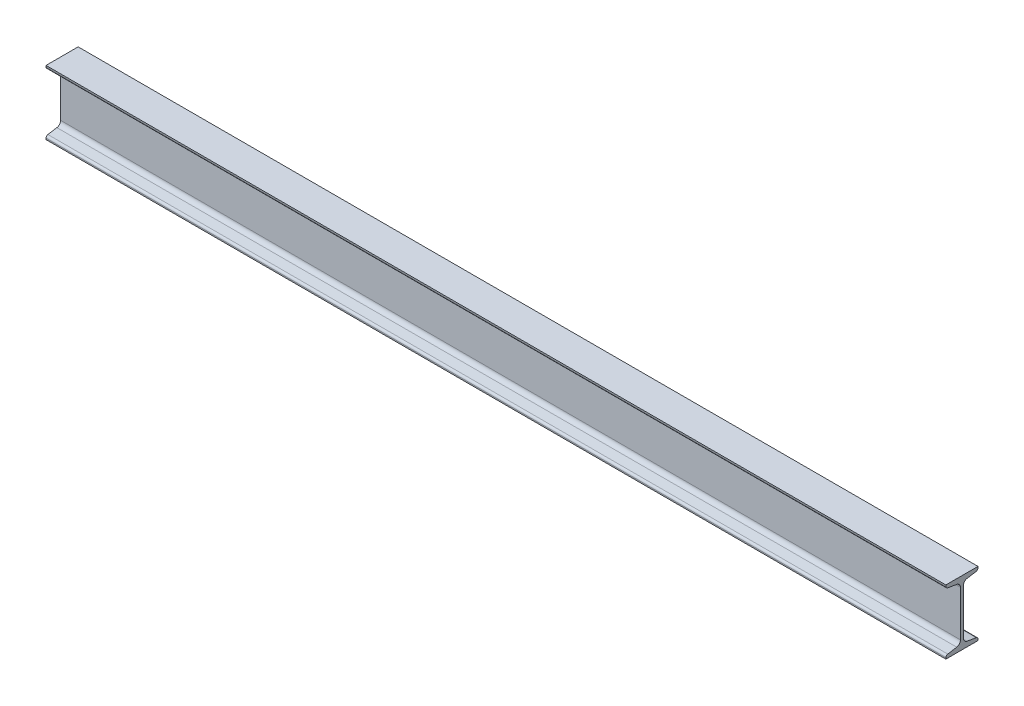
ISO-10303-21;
HEADER;
FILE_DESCRIPTION(('STEP AP214'),'2;1');
FILE_NAME('part.step','',(''),(''),'','','');
FILE_SCHEMA(('AUTOMOTIVE_DESIGN { 1 0 10303 214 1 1 1 1 }'));
ENDSEC;
DATA;
#1=APPLICATION_CONTEXT('core data for automotive mechanical design processes');
#2=APPLICATION_PROTOCOL_DEFINITION('international standard','automotive_design',2000,#1);
#3=PRODUCT_CONTEXT('',#1,'mechanical');
#4=PRODUCT('Part','Part','',(#3));
#5=PRODUCT_RELATED_PRODUCT_CATEGORY('part','',(#4));
#6=PRODUCT_DEFINITION_FORMATION('','',#4);
#7=PRODUCT_DEFINITION_CONTEXT('part definition',#1,'design');
#8=PRODUCT_DEFINITION('design','',#6,#7);
#9=PRODUCT_DEFINITION_SHAPE('','',#8);
#10=(LENGTH_UNIT() NAMED_UNIT(*) SI_UNIT(.MILLI.,.METRE.));
#11=(NAMED_UNIT(*) PLANE_ANGLE_UNIT() SI_UNIT($,.RADIAN.));
#12=(NAMED_UNIT(*) SI_UNIT($,.STERADIAN.) SOLID_ANGLE_UNIT());
#13=UNCERTAINTY_MEASURE_WITH_UNIT(LENGTH_MEASURE(1.E-05),#10,'distance_accuracy_value','');
#14=(GEOMETRIC_REPRESENTATION_CONTEXT(3) GLOBAL_UNCERTAINTY_ASSIGNED_CONTEXT((#13)) GLOBAL_UNIT_ASSIGNED_CONTEXT((#10,
#11,#12)) REPRESENTATION_CONTEXT('',''));
#15=CARTESIAN_POINT('',(0.,0.,0.));
#16=DIRECTION('',(0.,0.,1.));
#17=DIRECTION('',(1.,0.,0.));
#18=AXIS2_PLACEMENT_3D('',#15,#16,#17);
#19=CARTESIAN_POINT('',(1400.,50.,25.));
#20=DIRECTION('',(0.,-1.,0.));
#21=DIRECTION('',(0.,0.,-1.));
#22=AXIS2_PLACEMENT_3D('',#19,#20,#21);
#23=PLANE('',#22);
#24=DIRECTION('',(0.,0.,1.));
#25=VECTOR('',#24,1.);
#26=CARTESIAN_POINT('',(0.,50.,25.));
#27=LINE('',#26,#25);
#28=CARTESIAN_POINT('',(0.,50.0000000000001,-24.9999999999999));
#29=VERTEX_POINT('',#28);
#30=CARTESIAN_POINT('',(0.,50.,25.));
#31=VERTEX_POINT('',#30);
#32=EDGE_CURVE('E281',#29,#31,#27,.T.);
#33=ORIENTED_EDGE('',*,*,#32,.T.);
#34=DIRECTION('',(-1.,0.,0.));
#35=VECTOR('',#34,1.);
#36=CARTESIAN_POINT('',(1400.,50.,25.));
#37=LINE('',#36,#35);
#38=CARTESIAN_POINT('',(1400.,50.,25.));
#39=VERTEX_POINT('',#38);
#40=EDGE_CURVE('E13',#39,#31,#37,.T.);
#41=ORIENTED_EDGE('',*,*,#40,.F.);
#42=DIRECTION('',(0.,0.,1.));
#43=VECTOR('',#42,1.);
#44=CARTESIAN_POINT('',(1400.,50.,25.));
#45=LINE('',#44,#43);
#46=CARTESIAN_POINT('',(1400.,50.0000000000001,-24.9999999999999));
#47=VERTEX_POINT('',#46);
#48=EDGE_CURVE('E339',#47,#39,#45,.T.);
#49=ORIENTED_EDGE('',*,*,#48,.F.);
#50=DIRECTION('',(-1.,0.,0.));
#51=VECTOR('',#50,1.);
#52=CARTESIAN_POINT('',(1400.,50.0000000000001,-24.9999999999999));
#53=LINE('',#52,#51);
#54=EDGE_CURVE('E277',#47,#29,#53,.T.);
#55=ORIENTED_EDGE('',*,*,#54,.T.);
#56=EDGE_LOOP('',(#33,#41,#49,#55));
#57=FACE_BOUND('',#56,.T.);
#58=ADVANCED_FACE('F108',(#57),#23,.F.);
#59=CARTESIAN_POINT('',(1400.,48.0606710225334,25.0000000000002));
#60=DIRECTION('',(0.,0.,-1.));
#61=DIRECTION('',(0.,1.,0.));
#62=AXIS2_PLACEMENT_3D('',#59,#60,#61);
#63=PLANE('',#62);
#64=DIRECTION('',(0.,-1.,0.));
#65=VECTOR('',#64,1.);
#66=CARTESIAN_POINT('',(0.,48.0606710225334,25.0000000000002));
#67=LINE('',#66,#65);
#68=CARTESIAN_POINT('',(0.,48.0606710225334,25.0000000000002));
#69=VERTEX_POINT('',#68);
#70=EDGE_CURVE('E285',#31,#69,#67,.T.);
#71=ORIENTED_EDGE('',*,*,#70,.T.);
#72=DIRECTION('',(-1.,0.,0.));
#73=VECTOR('',#72,1.);
#74=CARTESIAN_POINT('',(1400.,48.0606710225334,25.0000000000002));
#75=LINE('',#74,#73);
#76=CARTESIAN_POINT('',(1400.,48.0606710225334,25.0000000000002));
#77=VERTEX_POINT('',#76);
#78=EDGE_CURVE('E117',#77,#69,#75,.T.);
#79=ORIENTED_EDGE('',*,*,#78,.F.);
#80=DIRECTION('',(0.,-1.,0.));
#81=VECTOR('',#80,1.);
#82=CARTESIAN_POINT('',(1400.,48.0606710225334,25.0000000000002));
#83=LINE('',#82,#81);
#84=EDGE_CURVE('E204',#39,#77,#83,.T.);
#85=ORIENTED_EDGE('',*,*,#84,.F.);
#86=ORIENTED_EDGE('',*,*,#40,.T.);
#87=EDGE_LOOP('',(#71,#79,#85,#86));
#88=FACE_BOUND('',#87,.T.);
#89=ADVANCED_FACE('F489',(#88),#63,.F.);
#90=CARTESIAN_POINT('',(1400.,48.0606710225334,21.5000000000002));
#91=DIRECTION('',(-1.,0.,0.));
#92=DIRECTION('',(0.,0.,1.));
#93=AXIS2_PLACEMENT_3D('',#90,#91,#92);
#94=CYLINDRICAL_SURFACE('',#93,3.5);
#95=CARTESIAN_POINT('',(0.,48.0606710225334,21.5000000000002));
#96=DIRECTION('',(1.,0.,0.));
#97=DIRECTION('',(0.,0.,-1.));
#98=AXIS2_PLACEMENT_3D('',#95,#96,#97);
#99=CIRCLE('',#98,3.5);
#100=CARTESIAN_POINT('',(0.,44.6082990961308,22.0754372961389));
#101=VERTEX_POINT('',#100);
#102=EDGE_CURVE('E288',#69,#101,#99,.T.);
#103=ORIENTED_EDGE('',*,*,#102,.T.);
#104=DIRECTION('',(-1.,0.,0.));
#105=VECTOR('',#104,1.);
#106=CARTESIAN_POINT('',(1400.,44.6082990961308,22.0754372961389));
#107=LINE('',#106,#105);
#108=CARTESIAN_POINT('',(1400.,44.6082990961308,22.0754372961389));
#109=VERTEX_POINT('',#108);
#110=EDGE_CURVE('E398',#109,#101,#107,.T.);
#111=ORIENTED_EDGE('',*,*,#110,.F.);
#112=CARTESIAN_POINT('',(1400.,48.0606710225334,21.5000000000002));
#113=DIRECTION('',(1.,0.,0.));
#114=DIRECTION('',(0.,0.,-1.));
#115=AXIS2_PLACEMENT_3D('',#112,#113,#114);
#116=CIRCLE('',#115,3.5);
#117=EDGE_CURVE('E408',#77,#109,#116,.T.);
#118=ORIENTED_EDGE('',*,*,#117,.F.);
#119=ORIENTED_EDGE('',*,*,#78,.T.);
#120=EDGE_LOOP('',(#103,#111,#118,#119));
#121=FACE_BOUND('',#120,.T.);
#122=ADVANCED_FACE('F406',(#121),#94,.T.);
#123=CARTESIAN_POINT('',(1400.,42.2787438528051,8.0991254077226));
#124=DIRECTION('',(0.,0.986391978972161,-0.164410656039636));
#125=DIRECTION('',(0.,0.164410656039636,0.986391978972161));
#126=AXIS2_PLACEMENT_3D('',#123,#124,#125);
#127=PLANE('',#126);
#128=DIRECTION('',(0.,-0.164410656039636,-0.986391978972161));
#129=VECTOR('',#128,1.);
#130=CARTESIAN_POINT('',(0.,42.2787438528051,8.0991254077226));
#131=LINE('',#130,#129);
#132=CARTESIAN_POINT('',(0.,42.278743852805,8.09912540772262));
#133=VERTEX_POINT('',#132);
#134=EDGE_CURVE('E291',#101,#133,#131,.T.);
#135=ORIENTED_EDGE('',*,*,#134,.T.);
#136=DIRECTION('',(-1.,0.,0.));
#137=VECTOR('',#136,1.);
#138=CARTESIAN_POINT('',(1400.,42.278743852805,8.09912540772262));
#139=LINE('',#138,#137);
#140=CARTESIAN_POINT('',(1400.,42.278743852805,8.09912540772262));
#141=VERTEX_POINT('',#140);
#142=EDGE_CURVE('E394',#141,#133,#139,.T.);
#143=ORIENTED_EDGE('',*,*,#142,.F.);
#144=DIRECTION('',(0.,-0.164410656039636,-0.986391978972161));
#145=VECTOR('',#144,1.);
#146=CARTESIAN_POINT('',(1400.,42.2787438528051,8.0991254077226));
#147=LINE('',#146,#145);
#148=EDGE_CURVE('E427',#109,#141,#147,.T.);
#149=ORIENTED_EDGE('',*,*,#148,.F.);
#150=ORIENTED_EDGE('',*,*,#110,.T.);
#151=EDGE_LOOP('',(#135,#143,#149,#150));
#152=FACE_BOUND('',#151,.T.);
#153=ADVANCED_FACE('F417',(#152),#127,.F.);
#154=CARTESIAN_POINT('',(1400.,35.374,9.25000000000002));
#155=DIRECTION('',(-1.,0.,0.));
#156=DIRECTION('',(0.,0.,1.));
#157=AXIS2_PLACEMENT_3D('',#154,#155,#156);
#158=CYLINDRICAL_SURFACE('',#157,6.99999999999985);
#159=CARTESIAN_POINT('',(0.,35.374,9.25000000000002));
#160=DIRECTION('',(-1.,0.,0.));
#161=DIRECTION('',(0.,0.,-1.));
#162=AXIS2_PLACEMENT_3D('',#159,#160,#161);
#163=CIRCLE('',#162,6.99999999999985);
#164=CARTESIAN_POINT('',(0.,35.374,2.25000000000028));
#165=VERTEX_POINT('',#164);
#166=EDGE_CURVE('E294',#133,#165,#163,.T.);
#167=ORIENTED_EDGE('',*,*,#166,.T.);
#168=DIRECTION('',(-1.,0.,0.));
#169=VECTOR('',#168,1.);
#170=CARTESIAN_POINT('',(1400.,35.374,2.25000000000028));
#171=LINE('',#170,#169);
#172=CARTESIAN_POINT('',(1400.,35.374,2.25000000000028));
#173=VERTEX_POINT('',#172);
#174=EDGE_CURVE('E390',#173,#165,#171,.T.);
#175=ORIENTED_EDGE('',*,*,#174,.F.);
#176=CARTESIAN_POINT('',(1400.,35.374,9.25000000000002));
#177=DIRECTION('',(-1.,0.,0.));
#178=DIRECTION('',(0.,0.,-1.));
#179=AXIS2_PLACEMENT_3D('',#176,#177,#178);
#180=CIRCLE('',#179,6.99999999999985);
#181=EDGE_CURVE('E423',#141,#173,#180,.T.);
#182=ORIENTED_EDGE('',*,*,#181,.F.);
#183=ORIENTED_EDGE('',*,*,#142,.T.);
#184=EDGE_LOOP('',(#167,#175,#182,#183));
#185=FACE_BOUND('',#184,.T.);
#186=ADVANCED_FACE('F421',(#185),#158,.F.);
#187=CARTESIAN_POINT('',(1400.,-35.374,2.24999999999999));
#188=DIRECTION('',(0.,0.,-1.));
#189=DIRECTION('',(0.,1.,0.));
#190=AXIS2_PLACEMENT_3D('',#187,#188,#189);
#191=PLANE('',#190);
#192=DIRECTION('',(0.,-1.,0.));
#193=VECTOR('',#192,1.);
#194=CARTESIAN_POINT('',(0.,-35.374,2.24999999999999));
#195=LINE('',#194,#193);
#196=CARTESIAN_POINT('',(0.,-35.374,2.24999999999999));
#197=VERTEX_POINT('',#196);
#198=EDGE_CURVE('E297',#165,#197,#195,.T.);
#199=ORIENTED_EDGE('',*,*,#198,.T.);
#200=DIRECTION('',(-1.,0.,0.));
#201=VECTOR('',#200,1.);
#202=CARTESIAN_POINT('',(1400.,-35.374,2.24999999999999));
#203=LINE('',#202,#201);
#204=CARTESIAN_POINT('',(1400.,-35.374,2.24999999999999));
#205=VERTEX_POINT('',#204);
#206=EDGE_CURVE('E386',#205,#197,#203,.T.);
#207=ORIENTED_EDGE('',*,*,#206,.F.);
#208=DIRECTION('',(0.,-1.,0.));
#209=VECTOR('',#208,1.);
#210=CARTESIAN_POINT('',(1400.,-35.374,2.24999999999999));
#211=LINE('',#210,#209);
#212=EDGE_CURVE('E426',#173,#205,#211,.T.);
#213=ORIENTED_EDGE('',*,*,#212,.F.);
#214=ORIENTED_EDGE('',*,*,#174,.T.);
#215=EDGE_LOOP('',(#199,#207,#213,#214));
#216=FACE_BOUND('',#215,.T.);
#217=ADVANCED_FACE('F502',(#216),#191,.F.);
#218=CARTESIAN_POINT('',(1400.,-35.374,9.24999999999996));
#219=DIRECTION('',(-1.,0.,0.));
#220=DIRECTION('',(0.,0.,1.));
#221=AXIS2_PLACEMENT_3D('',#218,#219,#220);
#222=CYLINDRICAL_SURFACE('',#221,6.99999999999997);
#223=CARTESIAN_POINT('',(0.,-35.374,9.24999999999996));
#224=DIRECTION('',(-1.,0.,0.));
#225=DIRECTION('',(0.,0.,-1.));
#226=AXIS2_PLACEMENT_3D('',#223,#224,#225);
#227=CIRCLE('',#226,6.99999999999997);
#228=CARTESIAN_POINT('',(0.,-42.2787438528051,8.09912540772244));
#229=VERTEX_POINT('',#228);
#230=EDGE_CURVE('E300',#197,#229,#227,.T.);
#231=ORIENTED_EDGE('',*,*,#230,.T.);
#232=DIRECTION('',(-1.,0.,0.));
#233=VECTOR('',#232,1.);
#234=CARTESIAN_POINT('',(1400.,-42.2787438528051,8.09912540772244));
#235=LINE('',#234,#233);
#236=CARTESIAN_POINT('',(1400.,-42.2787438528051,8.09912540772244));
#237=VERTEX_POINT('',#236);
#238=EDGE_CURVE('E382',#237,#229,#235,.T.);
#239=ORIENTED_EDGE('',*,*,#238,.F.);
#240=CARTESIAN_POINT('',(1400.,-35.374,9.24999999999996));
#241=DIRECTION('',(-1.,0.,0.));
#242=DIRECTION('',(0.,0.,-1.));
#243=AXIS2_PLACEMENT_3D('',#240,#241,#242);
#244=CIRCLE('',#243,6.99999999999997);
#245=EDGE_CURVE('E431',#205,#237,#244,.T.);
#246=ORIENTED_EDGE('',*,*,#245,.F.);
#247=ORIENTED_EDGE('',*,*,#206,.T.);
#248=EDGE_LOOP('',(#231,#239,#246,#247));
#249=FACE_BOUND('',#248,.T.);
#250=ADVANCED_FACE('F505',(#249),#222,.F.);
#251=CARTESIAN_POINT('',(1400.,-44.608299096131,22.0754372961385));
#252=DIRECTION('',(0.,-0.98639197897216,-0.164410656039645));
#253=DIRECTION('',(0.,0.164410656039645,-0.98639197897216));
#254=AXIS2_PLACEMENT_3D('',#251,#252,#253);
#255=PLANE('',#254);
#256=DIRECTION('',(0.,-0.164410656039645,0.98639197897216));
#257=VECTOR('',#256,1.);
#258=CARTESIAN_POINT('',(0.,-44.608299096131,22.0754372961385));
#259=LINE('',#258,#257);
#260=CARTESIAN_POINT('',(0.,-44.608299096131,22.0754372961385));
#261=VERTEX_POINT('',#260);
#262=EDGE_CURVE('E303',#229,#261,#259,.T.);
#263=ORIENTED_EDGE('',*,*,#262,.T.);
#264=DIRECTION('',(-1.,0.,0.));
#265=VECTOR('',#264,1.);
#266=CARTESIAN_POINT('',(1400.,-44.608299096131,22.0754372961385));
#267=LINE('',#266,#265);
#268=CARTESIAN_POINT('',(1400.,-44.608299096131,22.0754372961385));
#269=VERTEX_POINT('',#268);
#270=EDGE_CURVE('E378',#269,#261,#267,.T.);
#271=ORIENTED_EDGE('',*,*,#270,.F.);
#272=DIRECTION('',(0.,-0.164410656039645,0.98639197897216));
#273=VECTOR('',#272,1.);
#274=CARTESIAN_POINT('',(1400.,-44.608299096131,22.0754372961385));
#275=LINE('',#274,#273);
#276=EDGE_CURVE('E438',#237,#269,#275,.T.);
#277=ORIENTED_EDGE('',*,*,#276,.F.);
#278=ORIENTED_EDGE('',*,*,#238,.T.);
#279=EDGE_LOOP('',(#263,#271,#277,#278));
#280=FACE_BOUND('',#279,.T.);
#281=ADVANCED_FACE('F509',(#280),#255,.F.);
#282=CARTESIAN_POINT('',(1400.,-48.0606710225336,21.4999999999997));
#283=DIRECTION('',(-1.,0.,0.));
#284=DIRECTION('',(0.,0.,1.));
#285=AXIS2_PLACEMENT_3D('',#282,#283,#284);
#286=CYLINDRICAL_SURFACE('',#285,3.50000000000003);
#287=CARTESIAN_POINT('',(0.,-48.0606710225336,21.4999999999997));
#288=DIRECTION('',(1.,0.,0.));
#289=DIRECTION('',(0.,0.,-1.));
#290=AXIS2_PLACEMENT_3D('',#287,#288,#289);
#291=CIRCLE('',#290,3.50000000000003);
#292=CARTESIAN_POINT('',(0.,-48.0606710225335,24.9999999999998));
#293=VERTEX_POINT('',#292);
#294=EDGE_CURVE('E306',#261,#293,#291,.T.);
#295=ORIENTED_EDGE('',*,*,#294,.T.);
#296=DIRECTION('',(-1.,0.,0.));
#297=VECTOR('',#296,1.);
#298=CARTESIAN_POINT('',(1400.,-48.0606710225335,24.9999999999998));
#299=LINE('',#298,#297);
#300=CARTESIAN_POINT('',(1400.,-48.0606710225335,24.9999999999998));
#301=VERTEX_POINT('',#300);
#302=EDGE_CURVE('E374',#301,#293,#299,.T.);
#303=ORIENTED_EDGE('',*,*,#302,.F.);
#304=CARTESIAN_POINT('',(1400.,-48.0606710225336,21.4999999999997));
#305=DIRECTION('',(1.,0.,0.));
#306=DIRECTION('',(0.,0.,-1.));
#307=AXIS2_PLACEMENT_3D('',#304,#305,#306);
#308=CIRCLE('',#307,3.50000000000003);
#309=EDGE_CURVE('E441',#269,#301,#308,.T.);
#310=ORIENTED_EDGE('',*,*,#309,.F.);
#311=ORIENTED_EDGE('',*,*,#270,.T.);
#312=EDGE_LOOP('',(#295,#303,#310,#311));
#313=FACE_BOUND('',#312,.T.);
#314=ADVANCED_FACE('F513',(#313),#286,.T.);
#315=CARTESIAN_POINT('',(1400.,-50.0000000000001,24.9999999999998));
#316=DIRECTION('',(0.,0.,-1.));
#317=DIRECTION('',(0.,1.,0.));
#318=AXIS2_PLACEMENT_3D('',#315,#316,#317);
#319=PLANE('',#318);
#320=DIRECTION('',(0.,-1.,0.));
#321=VECTOR('',#320,1.);
#322=CARTESIAN_POINT('',(0.,-50.0000000000001,24.9999999999998));
#323=LINE('',#322,#321);
#324=CARTESIAN_POINT('',(0.,-50.0000000000001,24.9999999999998));
#325=VERTEX_POINT('',#324);
#326=EDGE_CURVE('E309',#293,#325,#323,.T.);
#327=ORIENTED_EDGE('',*,*,#326,.T.);
#328=DIRECTION('',(-1.,0.,0.));
#329=VECTOR('',#328,1.);
#330=CARTESIAN_POINT('',(1400.,-50.0000000000001,24.9999999999998));
#331=LINE('',#330,#329);
#332=CARTESIAN_POINT('',(1400.,-50.0000000000001,24.9999999999998));
#333=VERTEX_POINT('',#332);
#334=EDGE_CURVE('E370',#333,#325,#331,.T.);
#335=ORIENTED_EDGE('',*,*,#334,.F.);
#336=DIRECTION('',(0.,-1.,0.));
#337=VECTOR('',#336,1.);
#338=CARTESIAN_POINT('',(1400.,-50.0000000000001,24.9999999999998));
#339=LINE('',#338,#337);
#340=EDGE_CURVE('E444',#301,#333,#339,.T.);
#341=ORIENTED_EDGE('',*,*,#340,.F.);
#342=ORIENTED_EDGE('',*,*,#302,.T.);
#343=EDGE_LOOP('',(#327,#335,#341,#342));
#344=FACE_BOUND('',#343,.T.);
#345=ADVANCED_FACE('F517',(#344),#319,.F.);
#346=CARTESIAN_POINT('',(1400.,-49.9999999999999,-25.0000000000002));
#347=DIRECTION('',(0.,1.,0.));
#348=DIRECTION('',(0.,0.,1.));
#349=AXIS2_PLACEMENT_3D('',#346,#347,#348);
#350=PLANE('',#349);
#351=DIRECTION('',(0.,0.,-1.));
#352=VECTOR('',#351,1.);
#353=CARTESIAN_POINT('',(0.,-49.9999999999999,-25.0000000000002));
#354=LINE('',#353,#352);
#355=CARTESIAN_POINT('',(0.,-49.9999999999999,-25.0000000000002));
#356=VERTEX_POINT('',#355);
#357=EDGE_CURVE('E312',#325,#356,#354,.T.);
#358=ORIENTED_EDGE('',*,*,#357,.T.);
#359=DIRECTION('',(-1.,0.,0.));
#360=VECTOR('',#359,1.);
#361=CARTESIAN_POINT('',(1400.,-49.9999999999999,-25.0000000000002));
#362=LINE('',#361,#360);
#363=CARTESIAN_POINT('',(1400.,-49.9999999999999,-25.0000000000002));
#364=VERTEX_POINT('',#363);
#365=EDGE_CURVE('E366',#364,#356,#362,.T.);
#366=ORIENTED_EDGE('',*,*,#365,.F.);
#367=DIRECTION('',(0.,0.,-1.));
#368=VECTOR('',#367,1.);
#369=CARTESIAN_POINT('',(1400.,-49.9999999999999,-25.0000000000002));
#370=LINE('',#369,#368);
#371=EDGE_CURVE('E447',#333,#364,#370,.T.);
#372=ORIENTED_EDGE('',*,*,#371,.F.);
#373=ORIENTED_EDGE('',*,*,#334,.T.);
#374=EDGE_LOOP('',(#358,#366,#372,#373));
#375=FACE_BOUND('',#374,.T.);
#376=ADVANCED_FACE('F521',(#375),#350,.F.);
#377=CARTESIAN_POINT('',(1400.,-48.0606710225333,-25.0000000000002));
#378=DIRECTION('',(0.,0.,1.));
#379=DIRECTION('',(0.,-1.,0.));
#380=AXIS2_PLACEMENT_3D('',#377,#378,#379);
#381=PLANE('',#380);
#382=DIRECTION('',(0.,1.,0.));
#383=VECTOR('',#382,1.);
#384=CARTESIAN_POINT('',(0.,-48.0606710225333,-25.0000000000002));
#385=LINE('',#384,#383);
#386=CARTESIAN_POINT('',(0.,-48.0606710225333,-25.0000000000002));
#387=VERTEX_POINT('',#386);
#388=EDGE_CURVE('E315',#356,#387,#385,.T.);
#389=ORIENTED_EDGE('',*,*,#388,.T.);
#390=DIRECTION('',(-1.,0.,0.));
#391=VECTOR('',#390,1.);
#392=CARTESIAN_POINT('',(1400.,-48.0606710225333,-25.0000000000002));
#393=LINE('',#392,#391);
#394=CARTESIAN_POINT('',(1400.,-48.0606710225333,-25.0000000000002));
#395=VERTEX_POINT('',#394);
#396=EDGE_CURVE('E362',#395,#387,#393,.T.);
#397=ORIENTED_EDGE('',*,*,#396,.F.);
#398=DIRECTION('',(0.,1.,0.));
#399=VECTOR('',#398,1.);
#400=CARTESIAN_POINT('',(1400.,-48.0606710225333,-25.0000000000002));
#401=LINE('',#400,#399);
#402=EDGE_CURVE('E450',#364,#395,#401,.T.);
#403=ORIENTED_EDGE('',*,*,#402,.F.);
#404=ORIENTED_EDGE('',*,*,#365,.T.);
#405=EDGE_LOOP('',(#389,#397,#403,#404));
#406=FACE_BOUND('',#405,.T.);
#407=ADVANCED_FACE('F525',(#406),#381,.F.);
#408=CARTESIAN_POINT('',(1400.,-48.0606710225333,-21.5000000000003));
#409=DIRECTION('',(-1.,0.,0.));
#410=DIRECTION('',(0.,0.,1.));
#411=AXIS2_PLACEMENT_3D('',#408,#409,#410);
#412=CYLINDRICAL_SURFACE('',#411,3.49999999999993);
#413=CARTESIAN_POINT('',(0.,-48.0606710225333,-21.5000000000003));
#414=DIRECTION('',(1.,0.,0.));
#415=DIRECTION('',(0.,0.,1.));
#416=AXIS2_PLACEMENT_3D('',#413,#414,#415);
#417=CIRCLE('',#416,3.49999999999993);
#418=CARTESIAN_POINT('',(0.,-44.6082990961308,-22.075437296139));
#419=VERTEX_POINT('',#418);
#420=EDGE_CURVE('E318',#387,#419,#417,.T.);
#421=ORIENTED_EDGE('',*,*,#420,.T.);
#422=DIRECTION('',(-1.,0.,0.));
#423=VECTOR('',#422,1.);
#424=CARTESIAN_POINT('',(1400.,-44.6082990961308,-22.075437296139));
#425=LINE('',#424,#423);
#426=CARTESIAN_POINT('',(1400.,-44.6082990961308,-22.075437296139));
#427=VERTEX_POINT('',#426);
#428=EDGE_CURVE('E358',#427,#419,#425,.T.);
#429=ORIENTED_EDGE('',*,*,#428,.F.);
#430=CARTESIAN_POINT('',(1400.,-48.0606710225333,-21.5000000000003));
#431=DIRECTION('',(1.,0.,0.));
#432=DIRECTION('',(0.,0.,1.));
#433=AXIS2_PLACEMENT_3D('',#430,#431,#432);
#434=CIRCLE('',#433,3.49999999999993);
#435=EDGE_CURVE('E453',#395,#427,#434,.T.);
#436=ORIENTED_EDGE('',*,*,#435,.F.);
#437=ORIENTED_EDGE('',*,*,#396,.T.);
#438=EDGE_LOOP('',(#421,#429,#436,#437));
#439=FACE_BOUND('',#438,.T.);
#440=ADVANCED_FACE('F529',(#439),#412,.T.);
#441=CARTESIAN_POINT('',(1400.,-42.2787438528052,-8.09912540772258));
#442=DIRECTION('',(0.,-0.986391978972163,0.164410656039625));
#443=DIRECTION('',(0.,-0.164410656039625,-0.986391978972163));
#444=AXIS2_PLACEMENT_3D('',#441,#442,#443);
#445=PLANE('',#444);
#446=DIRECTION('',(0.,0.164410656039625,0.986391978972163));
#447=VECTOR('',#446,1.);
#448=CARTESIAN_POINT('',(0.,-42.2787438528052,-8.09912540772258));
#449=LINE('',#448,#447);
#450=CARTESIAN_POINT('',(0.,-42.2787438528051,-8.09912540772259));
#451=VERTEX_POINT('',#450);
#452=EDGE_CURVE('E321',#419,#451,#449,.T.);
#453=ORIENTED_EDGE('',*,*,#452,.T.);
#454=DIRECTION('',(-1.,0.,0.));
#455=VECTOR('',#454,1.);
#456=CARTESIAN_POINT('',(1400.,-42.2787438528051,-8.09912540772259));
#457=LINE('',#456,#455);
#458=CARTESIAN_POINT('',(1400.,-42.2787438528051,-8.09912540772259));
#459=VERTEX_POINT('',#458);
#460=EDGE_CURVE('E354',#459,#451,#457,.T.);
#461=ORIENTED_EDGE('',*,*,#460,.F.);
#462=DIRECTION('',(0.,0.164410656039625,0.986391978972163));
#463=VECTOR('',#462,1.);
#464=CARTESIAN_POINT('',(1400.,-42.2787438528052,-8.09912540772258));
#465=LINE('',#464,#463);
#466=EDGE_CURVE('E456',#427,#459,#465,.T.);
#467=ORIENTED_EDGE('',*,*,#466,.F.);
#468=ORIENTED_EDGE('',*,*,#428,.T.);
#469=EDGE_LOOP('',(#453,#461,#467,#468));
#470=FACE_BOUND('',#469,.T.);
#471=ADVANCED_FACE('F533',(#470),#445,.F.);
#472=CARTESIAN_POINT('',(1400.,-35.374,-9.24999999999992));
#473=DIRECTION('',(-1.,0.,0.));
#474=DIRECTION('',(0.,0.,1.));
#475=AXIS2_PLACEMENT_3D('',#472,#473,#474);
#476=CYLINDRICAL_SURFACE('',#475,6.99999999999999);
#477=CARTESIAN_POINT('',(0.,-35.374,-9.24999999999992));
#478=DIRECTION('',(-1.,0.,0.));
#479=DIRECTION('',(0.,0.,-1.));
#480=AXIS2_PLACEMENT_3D('',#477,#478,#479);
#481=CIRCLE('',#480,6.99999999999999);
#482=CARTESIAN_POINT('',(0.,-35.374,-2.24999999999999));
#483=VERTEX_POINT('',#482);
#484=EDGE_CURVE('E324',#451,#483,#481,.T.);
#485=ORIENTED_EDGE('',*,*,#484,.T.);
#486=DIRECTION('',(-1.,0.,0.));
#487=VECTOR('',#486,1.);
#488=CARTESIAN_POINT('',(1400.,-35.374,-2.24999999999999));
#489=LINE('',#488,#487);
#490=CARTESIAN_POINT('',(1400.,-35.374,-2.24999999999999));
#491=VERTEX_POINT('',#490);
#492=EDGE_CURVE('E350',#491,#483,#489,.T.);
#493=ORIENTED_EDGE('',*,*,#492,.F.);
#494=CARTESIAN_POINT('',(1400.,-35.374,-9.24999999999992));
#495=DIRECTION('',(-1.,0.,0.));
#496=DIRECTION('',(0.,0.,-1.));
#497=AXIS2_PLACEMENT_3D('',#494,#495,#496);
#498=CIRCLE('',#497,6.99999999999999);
#499=EDGE_CURVE('E459',#459,#491,#498,.T.);
#500=ORIENTED_EDGE('',*,*,#499,.F.);
#501=ORIENTED_EDGE('',*,*,#460,.T.);
#502=EDGE_LOOP('',(#485,#493,#500,#501));
#503=FACE_BOUND('',#502,.T.);
#504=ADVANCED_FACE('F537',(#503),#476,.F.);
#505=CARTESIAN_POINT('',(1400.,35.374,-2.24999999999971));
#506=DIRECTION('',(0.,0.,1.));
#507=DIRECTION('',(0.,-1.,0.));
#508=AXIS2_PLACEMENT_3D('',#505,#506,#507);
#509=PLANE('',#508);
#510=DIRECTION('',(0.,1.,0.));
#511=VECTOR('',#510,1.);
#512=CARTESIAN_POINT('',(0.,35.374,-2.24999999999971));
#513=LINE('',#512,#511);
#514=CARTESIAN_POINT('',(0.,35.374,-2.24999999999967));
#515=VERTEX_POINT('',#514);
#516=EDGE_CURVE('E327',#483,#515,#513,.T.);
#517=ORIENTED_EDGE('',*,*,#516,.T.);
#518=DIRECTION('',(-1.,0.,0.));
#519=VECTOR('',#518,1.);
#520=CARTESIAN_POINT('',(1400.,35.374,-2.24999999999967));
#521=LINE('',#520,#519);
#522=CARTESIAN_POINT('',(1400.,35.374,-2.24999999999967));
#523=VERTEX_POINT('',#522);
#524=EDGE_CURVE('E346',#523,#515,#521,.T.);
#525=ORIENTED_EDGE('',*,*,#524,.F.);
#526=DIRECTION('',(0.,1.,0.));
#527=VECTOR('',#526,1.);
#528=CARTESIAN_POINT('',(1400.,35.374,-2.24999999999971));
#529=LINE('',#528,#527);
#530=EDGE_CURVE('E462',#491,#523,#529,.T.);
#531=ORIENTED_EDGE('',*,*,#530,.F.);
#532=ORIENTED_EDGE('',*,*,#492,.T.);
#533=EDGE_LOOP('',(#517,#525,#531,#532));
#534=FACE_BOUND('',#533,.T.);
#535=ADVANCED_FACE('F470',(#534),#509,.F.);
#536=CARTESIAN_POINT('',(1400.,35.374,-9.24999999999968));
#537=DIRECTION('',(-1.,0.,0.));
#538=DIRECTION('',(0.,0.,1.));
#539=AXIS2_PLACEMENT_3D('',#536,#537,#538);
#540=CYLINDRICAL_SURFACE('',#539,7.00000000000001);
#541=CARTESIAN_POINT('',(0.,35.374,-9.24999999999968));
#542=DIRECTION('',(-1.,0.,0.));
#543=DIRECTION('',(0.,0.,-1.));
#544=AXIS2_PLACEMENT_3D('',#541,#542,#543);
#545=CIRCLE('',#544,7.00000000000001);
#546=CARTESIAN_POINT('',(0.,42.2787438528052,-8.0991254077223));
#547=VERTEX_POINT('',#546);
#548=EDGE_CURVE('E330',#515,#547,#545,.T.);
#549=ORIENTED_EDGE('',*,*,#548,.T.);
#550=DIRECTION('',(-1.,0.,0.));
#551=VECTOR('',#550,1.);
#552=CARTESIAN_POINT('',(1400.,42.2787438528052,-8.0991254077223));
#553=LINE('',#552,#551);
#554=CARTESIAN_POINT('',(1400.,42.2787438528052,-8.0991254077223));
#555=VERTEX_POINT('',#554);
#556=EDGE_CURVE('E270',#555,#547,#553,.T.);
#557=ORIENTED_EDGE('',*,*,#556,.F.);
#558=CARTESIAN_POINT('',(1400.,35.374,-9.24999999999968));
#559=DIRECTION('',(-1.,0.,0.));
#560=DIRECTION('',(0.,0.,-1.));
#561=AXIS2_PLACEMENT_3D('',#558,#559,#560);
#562=CIRCLE('',#561,7.00000000000001);
#563=EDGE_CURVE('E259',#523,#555,#562,.T.);
#564=ORIENTED_EDGE('',*,*,#563,.F.);
#565=ORIENTED_EDGE('',*,*,#524,.T.);
#566=EDGE_LOOP('',(#549,#557,#564,#565));
#567=FACE_BOUND('',#566,.T.);
#568=ADVANCED_FACE('F474',(#567),#540,.F.);
#569=CARTESIAN_POINT('',(1400.,44.6082990961309,-22.0754372961386));
#570=DIRECTION('',(0.,0.986391978972162,0.16441065603963));
#571=DIRECTION('',(0.,-0.16441065603963,0.986391978972162));
#572=AXIS2_PLACEMENT_3D('',#569,#570,#571);
#573=PLANE('',#572);
#574=DIRECTION('',(0.,0.16441065603963,-0.986391978972162));
#575=VECTOR('',#574,1.);
#576=CARTESIAN_POINT('',(0.,44.6082990961309,-22.0754372961386));
#577=LINE('',#576,#575);
#578=CARTESIAN_POINT('',(0.,44.6082990961309,-22.0754372961386));
#579=VERTEX_POINT('',#578);
#580=EDGE_CURVE('E268',#547,#579,#577,.T.);
#581=ORIENTED_EDGE('',*,*,#580,.T.);
#582=DIRECTION('',(-1.,0.,0.));
#583=VECTOR('',#582,1.);
#584=CARTESIAN_POINT('',(1400.,44.6082990961309,-22.0754372961386));
#585=LINE('',#584,#583);
#586=CARTESIAN_POINT('',(1400.,44.6082990961309,-22.0754372961386));
#587=VERTEX_POINT('',#586);
#588=EDGE_CURVE('E265',#587,#579,#585,.T.);
#589=ORIENTED_EDGE('',*,*,#588,.F.);
#590=DIRECTION('',(0.,0.16441065603963,-0.986391978972162));
#591=VECTOR('',#590,1.);
#592=CARTESIAN_POINT('',(1400.,44.6082990961309,-22.0754372961386));
#593=LINE('',#592,#591);
#594=EDGE_CURVE('E253',#555,#587,#593,.T.);
#595=ORIENTED_EDGE('',*,*,#594,.F.);
#596=ORIENTED_EDGE('',*,*,#556,.T.);
#597=EDGE_LOOP('',(#581,#589,#595,#596));
#598=FACE_BOUND('',#597,.T.);
#599=ADVANCED_FACE('F266',(#598),#573,.F.);
#600=CARTESIAN_POINT('',(1400.,48.0606710225335,-21.4999999999999));
#601=DIRECTION('',(-1.,0.,0.));
#602=DIRECTION('',(0.,0.,1.));
#603=AXIS2_PLACEMENT_3D('',#600,#601,#602);
#604=CYLINDRICAL_SURFACE('',#603,3.49999999999999);
#605=CARTESIAN_POINT('',(0.,48.0606710225335,-21.4999999999999));
#606=DIRECTION('',(1.,0.,0.));
#607=DIRECTION('',(0.,0.,1.));
#608=AXIS2_PLACEMENT_3D('',#605,#606,#607);
#609=CIRCLE('',#608,3.49999999999999);
#610=CARTESIAN_POINT('',(0.,48.0606710225335,-24.9999999999999));
#611=VERTEX_POINT('',#610);
#612=EDGE_CURVE('E190',#579,#611,#609,.T.);
#613=ORIENTED_EDGE('',*,*,#612,.T.);
#614=DIRECTION('',(-1.,0.,0.));
#615=VECTOR('',#614,1.);
#616=CARTESIAN_POINT('',(1400.,48.0606710225335,-24.9999999999999));
#617=LINE('',#616,#615);
#618=CARTESIAN_POINT('',(1400.,48.0606710225335,-24.9999999999999));
#619=VERTEX_POINT('',#618);
#620=EDGE_CURVE('E271',#619,#611,#617,.T.);
#621=ORIENTED_EDGE('',*,*,#620,.F.);
#622=CARTESIAN_POINT('',(1400.,48.0606710225335,-21.4999999999999));
#623=DIRECTION('',(1.,0.,0.));
#624=DIRECTION('',(0.,0.,1.));
#625=AXIS2_PLACEMENT_3D('',#622,#623,#624);
#626=CIRCLE('',#625,3.49999999999999);
#627=EDGE_CURVE('E257',#587,#619,#626,.T.);
#628=ORIENTED_EDGE('',*,*,#627,.F.);
#629=ORIENTED_EDGE('',*,*,#588,.T.);
#630=EDGE_LOOP('',(#613,#621,#628,#629));
#631=FACE_BOUND('',#630,.T.);
#632=ADVANCED_FACE('F273',(#631),#604,.T.);
#633=CARTESIAN_POINT('',(1400.,50.0000000000001,-24.9999999999999));
#634=DIRECTION('',(0.,0.,1.));
#635=DIRECTION('',(0.,-1.,0.));
#636=AXIS2_PLACEMENT_3D('',#633,#634,#635);
#637=PLANE('',#636);
#638=DIRECTION('',(0.,1.,0.));
#639=VECTOR('',#638,1.);
#640=CARTESIAN_POINT('',(0.,50.0000000000001,-24.9999999999999));
#641=LINE('',#640,#639);
#642=EDGE_CURVE('E196',#611,#29,#641,.T.);
#643=ORIENTED_EDGE('',*,*,#642,.T.);
#644=ORIENTED_EDGE('',*,*,#54,.F.);
#645=DIRECTION('',(0.,1.,0.));
#646=VECTOR('',#645,1.);
#647=CARTESIAN_POINT('',(1400.,50.0000000000001,-24.9999999999999));
#648=LINE('',#647,#646);
#649=EDGE_CURVE('E125',#619,#47,#648,.T.);
#650=ORIENTED_EDGE('',*,*,#649,.F.);
#651=ORIENTED_EDGE('',*,*,#620,.T.);
#652=EDGE_LOOP('',(#643,#644,#650,#651));
#653=FACE_BOUND('',#652,.T.);
#654=ADVANCED_FACE('F478',(#653),#637,.F.);
#655=CARTESIAN_POINT('',(1400.,48.0606710225335,-21.4999999999999));
#656=DIRECTION('',(-1.,0.,0.));
#657=DIRECTION('',(0.,0.,1.));
#658=AXIS2_PLACEMENT_3D('',#655,#656,#657);
#659=PLANE('',#658);
#660=ORIENTED_EDGE('',*,*,#48,.T.);
#661=ORIENTED_EDGE('',*,*,#84,.T.);
#662=ORIENTED_EDGE('',*,*,#117,.T.);
#663=ORIENTED_EDGE('',*,*,#148,.T.);
#664=ORIENTED_EDGE('',*,*,#181,.T.);
#665=ORIENTED_EDGE('',*,*,#212,.T.);
#666=ORIENTED_EDGE('',*,*,#245,.T.);
#667=ORIENTED_EDGE('',*,*,#276,.T.);
#668=ORIENTED_EDGE('',*,*,#309,.T.);
#669=ORIENTED_EDGE('',*,*,#340,.T.);
#670=ORIENTED_EDGE('',*,*,#371,.T.);
#671=ORIENTED_EDGE('',*,*,#402,.T.);
#672=ORIENTED_EDGE('',*,*,#435,.T.);
#673=ORIENTED_EDGE('',*,*,#466,.T.);
#674=ORIENTED_EDGE('',*,*,#499,.T.);
#675=ORIENTED_EDGE('',*,*,#530,.T.);
#676=ORIENTED_EDGE('',*,*,#563,.T.);
#677=ORIENTED_EDGE('',*,*,#594,.T.);
#678=ORIENTED_EDGE('',*,*,#627,.T.);
#679=ORIENTED_EDGE('',*,*,#649,.T.);
#680=EDGE_LOOP('',(#660,#661,#662,#663,#664,#665,#666,#667,#668,#669,#670,#671,#672,#673,#674,
#675,#676,#677,#678,#679));
#681=FACE_BOUND('',#680,.T.);
#682=ADVANCED_FACE('F255',(#681),#659,.F.);
#683=CARTESIAN_POINT('',(0.,48.0606710225335,-21.4999999999999));
#684=DIRECTION('',(-1.,0.,0.));
#685=DIRECTION('',(0.,0.,1.));
#686=AXIS2_PLACEMENT_3D('',#683,#684,#685);
#687=PLANE('',#686);
#688=ORIENTED_EDGE('',*,*,#32,.F.);
#689=ORIENTED_EDGE('',*,*,#642,.F.);
#690=ORIENTED_EDGE('',*,*,#612,.F.);
#691=ORIENTED_EDGE('',*,*,#580,.F.);
#692=ORIENTED_EDGE('',*,*,#548,.F.);
#693=ORIENTED_EDGE('',*,*,#516,.F.);
#694=ORIENTED_EDGE('',*,*,#484,.F.);
#695=ORIENTED_EDGE('',*,*,#452,.F.);
#696=ORIENTED_EDGE('',*,*,#420,.F.);
#697=ORIENTED_EDGE('',*,*,#388,.F.);
#698=ORIENTED_EDGE('',*,*,#357,.F.);
#699=ORIENTED_EDGE('',*,*,#326,.F.);
#700=ORIENTED_EDGE('',*,*,#294,.F.);
#701=ORIENTED_EDGE('',*,*,#262,.F.);
#702=ORIENTED_EDGE('',*,*,#230,.F.);
#703=ORIENTED_EDGE('',*,*,#198,.F.);
#704=ORIENTED_EDGE('',*,*,#166,.F.);
#705=ORIENTED_EDGE('',*,*,#134,.F.);
#706=ORIENTED_EDGE('',*,*,#102,.F.);
#707=ORIENTED_EDGE('',*,*,#70,.F.);
#708=EDGE_LOOP('',(#688,#689,#690,#691,#692,#693,#694,#695,#696,#697,#698,#699,#700,#701,#702,
#703,#704,#705,#706,#707));
#709=FACE_BOUND('',#708,.T.);
#710=ADVANCED_FACE('F412',(#709),#687,.T.);
#711=CLOSED_SHELL('',(#58,#89,#122,#153,#186,#217,#250,#281,#314,#345,#376,#407,#440,#471,#504,
#535,#568,#599,#632,#654,#682,#710));
#712=MANIFOLD_SOLID_BREP('B2',#711);
#713=ADVANCED_BREP_SHAPE_REPRESENTATION('',(#18,#712),#14);
#714=SHAPE_DEFINITION_REPRESENTATION(#9,#713);
ENDSEC;
END-ISO-10303-21;
